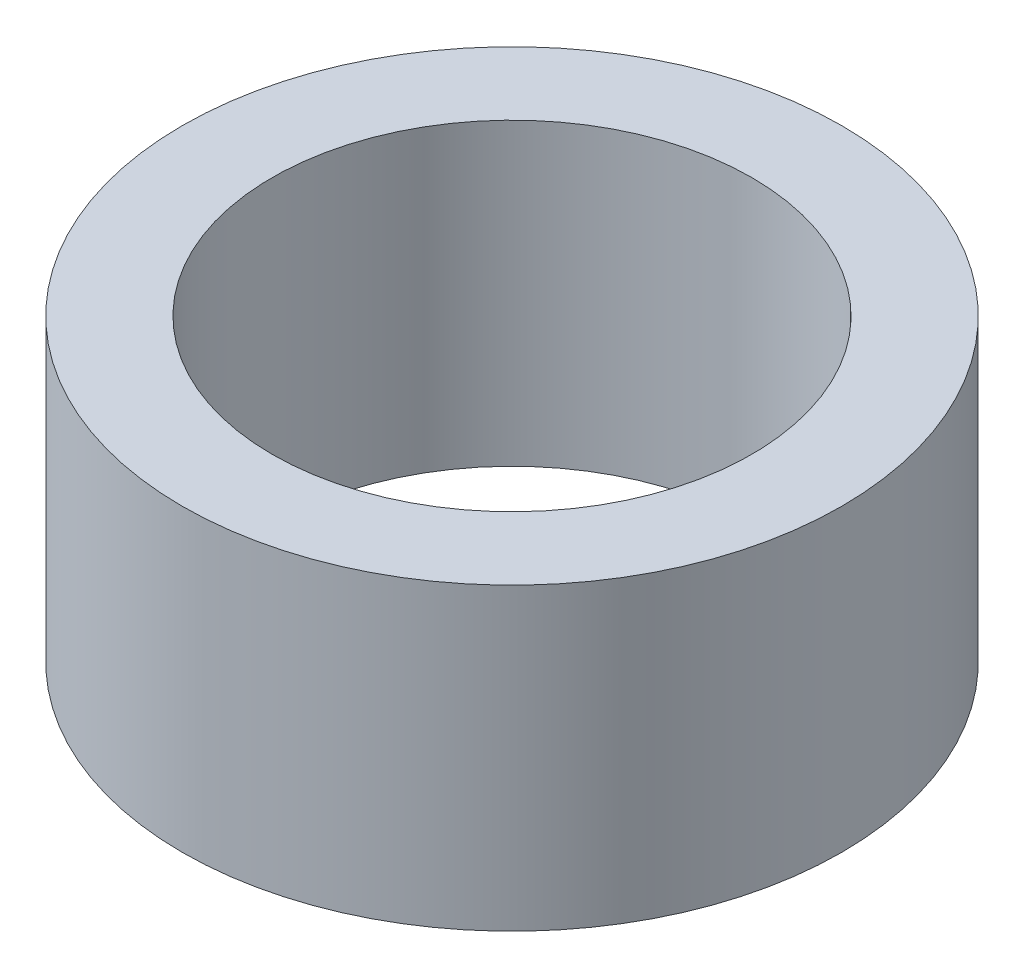
ISO-10303-21;
HEADER;
FILE_DESCRIPTION(('STEP AP214'),'2;1');
FILE_NAME('part.step','',(''),(''),'','','');
FILE_SCHEMA(('AUTOMOTIVE_DESIGN { 1 0 10303 214 1 1 1 1 }'));
ENDSEC;
DATA;
#1=APPLICATION_CONTEXT('core data for automotive mechanical design processes');
#2=APPLICATION_PROTOCOL_DEFINITION('international standard','automotive_design',2000,#1);
#3=PRODUCT_CONTEXT('',#1,'mechanical');
#4=PRODUCT('Part','Part','',(#3));
#5=PRODUCT_RELATED_PRODUCT_CATEGORY('part','',(#4));
#6=PRODUCT_DEFINITION_FORMATION('','',#4);
#7=PRODUCT_DEFINITION_CONTEXT('part definition',#1,'design');
#8=PRODUCT_DEFINITION('design','',#6,#7);
#9=PRODUCT_DEFINITION_SHAPE('','',#8);
#10=(LENGTH_UNIT() NAMED_UNIT(*) SI_UNIT(.MILLI.,.METRE.));
#11=(NAMED_UNIT(*) PLANE_ANGLE_UNIT() SI_UNIT($,.RADIAN.));
#12=(NAMED_UNIT(*) SI_UNIT($,.STERADIAN.) SOLID_ANGLE_UNIT());
#13=UNCERTAINTY_MEASURE_WITH_UNIT(LENGTH_MEASURE(1.E-05),#10,'distance_accuracy_value','');
#14=(GEOMETRIC_REPRESENTATION_CONTEXT(3) GLOBAL_UNCERTAINTY_ASSIGNED_CONTEXT((#13)) GLOBAL_UNIT_ASSIGNED_CONTEXT((#10,
#11,#12)) REPRESENTATION_CONTEXT('',''));
#15=CARTESIAN_POINT('',(0.,0.,0.));
#16=DIRECTION('',(0.,0.,1.));
#17=DIRECTION('',(1.,0.,0.));
#18=AXIS2_PLACEMENT_3D('',#15,#16,#17);
#19=CARTESIAN_POINT('',(0.,2.,0.));
#20=DIRECTION('',(0.,1.,0.));
#21=DIRECTION('',(0.,0.,1.));
#22=AXIS2_PLACEMENT_3D('',#19,#20,#21);
#23=PLANE('',#22);
#24=CARTESIAN_POINT('',(0.,2.,0.));
#25=DIRECTION('',(0.,1.,0.));
#26=DIRECTION('',(0.,0.,1.));
#27=AXIS2_PLACEMENT_3D('',#24,#25,#26);
#28=CIRCLE('',#27,2.2);
#29=CARTESIAN_POINT('',(0.,2.,2.2));
#30=VERTEX_POINT('',#29);
#31=EDGE_CURVE('E10',#30,#30,#28,.T.);
#32=ORIENTED_EDGE('',*,*,#31,.T.);
#33=EDGE_LOOP('',(#32));
#34=FACE_BOUND('',#33,.T.);
#35=CARTESIAN_POINT('',(0.,2.,0.));
#36=DIRECTION('',(0.,1.,0.));
#37=DIRECTION('',(0.,0.,1.));
#38=AXIS2_PLACEMENT_3D('',#35,#36,#37);
#39=CIRCLE('',#38,1.6);
#40=CARTESIAN_POINT('',(0.,2.,1.6));
#41=VERTEX_POINT('',#40);
#42=EDGE_CURVE('E41',#41,#41,#39,.T.);
#43=ORIENTED_EDGE('',*,*,#42,.F.);
#44=EDGE_LOOP('',(#43));
#45=FACE_BOUND('',#44,.T.);
#46=ADVANCED_FACE('F30',(#34,#45),#23,.T.);
#47=CARTESIAN_POINT('',(0.,0.,0.));
#48=DIRECTION('',(0.,1.,0.));
#49=DIRECTION('',(0.,0.,1.));
#50=AXIS2_PLACEMENT_3D('',#47,#48,#49);
#51=PLANE('',#50);
#52=CARTESIAN_POINT('',(0.,0.,0.));
#53=DIRECTION('',(0.,1.,0.));
#54=DIRECTION('',(0.,0.,1.));
#55=AXIS2_PLACEMENT_3D('',#52,#53,#54);
#56=CIRCLE('',#55,2.2);
#57=CARTESIAN_POINT('',(0.,0.,2.2));
#58=VERTEX_POINT('',#57);
#59=EDGE_CURVE('E34',#58,#58,#56,.T.);
#60=ORIENTED_EDGE('',*,*,#59,.F.);
#61=EDGE_LOOP('',(#60));
#62=FACE_BOUND('',#61,.T.);
#63=CARTESIAN_POINT('',(0.,0.,0.));
#64=DIRECTION('',(0.,1.,0.));
#65=DIRECTION('',(0.,0.,1.));
#66=AXIS2_PLACEMENT_3D('',#63,#64,#65);
#67=CIRCLE('',#66,1.6);
#68=CARTESIAN_POINT('',(0.,0.,1.6));
#69=VERTEX_POINT('',#68);
#70=EDGE_CURVE('E43',#69,#69,#67,.T.);
#71=ORIENTED_EDGE('',*,*,#70,.T.);
#72=EDGE_LOOP('',(#71));
#73=FACE_BOUND('',#72,.T.);
#74=ADVANCED_FACE('F53',(#62,#73),#51,.F.);
#75=CARTESIAN_POINT('',(0.,2.,0.));
#76=DIRECTION('',(0.,-1.,0.));
#77=DIRECTION('',(0.,0.,-1.));
#78=AXIS2_PLACEMENT_3D('',#75,#76,#77);
#79=CYLINDRICAL_SURFACE('',#78,2.2);
#80=ORIENTED_EDGE('',*,*,#31,.F.);
#81=EDGE_LOOP('',(#80));
#82=FACE_BOUND('',#81,.T.);
#83=ORIENTED_EDGE('',*,*,#59,.T.);
#84=EDGE_LOOP('',(#83));
#85=FACE_BOUND('',#84,.T.);
#86=ADVANCED_FACE('F32',(#82,#85),#79,.T.);
#87=CARTESIAN_POINT('',(0.,2.,0.));
#88=DIRECTION('',(0.,-1.,0.));
#89=DIRECTION('',(0.,0.,-1.));
#90=AXIS2_PLACEMENT_3D('',#87,#88,#89);
#91=CYLINDRICAL_SURFACE('',#90,1.6);
#92=ORIENTED_EDGE('',*,*,#42,.T.);
#93=EDGE_LOOP('',(#92));
#94=FACE_BOUND('',#93,.T.);
#95=ORIENTED_EDGE('',*,*,#70,.F.);
#96=EDGE_LOOP('',(#95));
#97=FACE_BOUND('',#96,.T.);
#98=ADVANCED_FACE('F49',(#94,#97),#91,.F.);
#99=CLOSED_SHELL('',(#46,#74,#86,#98));
#100=MANIFOLD_SOLID_BREP('B2',#99);
#101=ADVANCED_BREP_SHAPE_REPRESENTATION('',(#18,#100),#14);
#102=SHAPE_DEFINITION_REPRESENTATION(#9,#101);
ENDSEC;
END-ISO-10303-21;
